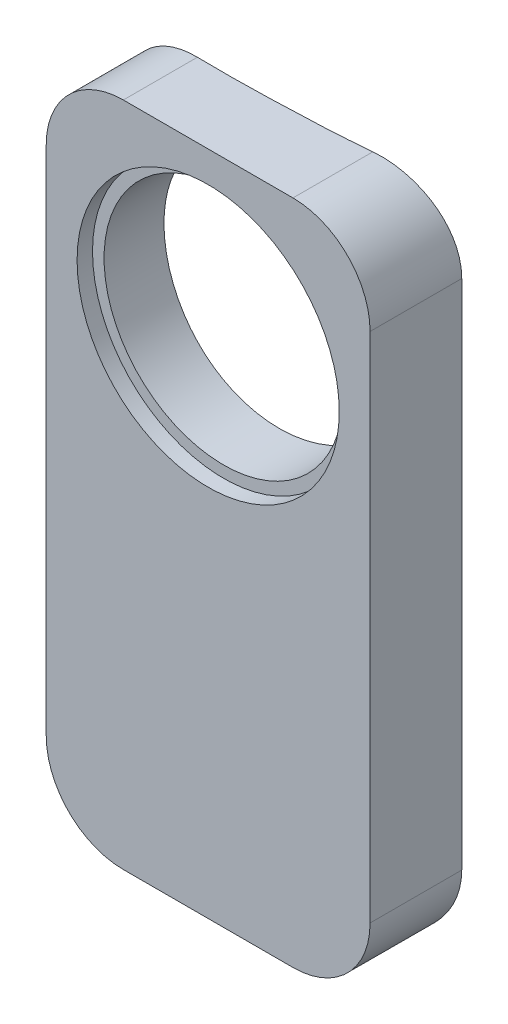
ISO-10303-21;
HEADER;
FILE_DESCRIPTION(('STEP AP214'),'2;1');
FILE_NAME('part.step','',(''),(''),'','','');
FILE_SCHEMA(('AUTOMOTIVE_DESIGN { 1 0 10303 214 1 1 1 1 }'));
ENDSEC;
DATA;
#1=APPLICATION_CONTEXT('core data for automotive mechanical design processes');
#2=APPLICATION_PROTOCOL_DEFINITION('international standard','automotive_design',2000,#1);
#3=PRODUCT_CONTEXT('',#1,'mechanical');
#4=PRODUCT('Part','Part','',(#3));
#5=PRODUCT_RELATED_PRODUCT_CATEGORY('part','',(#4));
#6=PRODUCT_DEFINITION_FORMATION('','',#4);
#7=PRODUCT_DEFINITION_CONTEXT('part definition',#1,'design');
#8=PRODUCT_DEFINITION('design','',#6,#7);
#9=PRODUCT_DEFINITION_SHAPE('','',#8);
#10=(LENGTH_UNIT() NAMED_UNIT(*) SI_UNIT(.MILLI.,.METRE.));
#11=(NAMED_UNIT(*) PLANE_ANGLE_UNIT() SI_UNIT($,.RADIAN.));
#12=(NAMED_UNIT(*) SI_UNIT($,.STERADIAN.) SOLID_ANGLE_UNIT());
#13=UNCERTAINTY_MEASURE_WITH_UNIT(LENGTH_MEASURE(1.E-05),#10,'distance_accuracy_value','');
#14=(GEOMETRIC_REPRESENTATION_CONTEXT(3) GLOBAL_UNCERTAINTY_ASSIGNED_CONTEXT((#13)) GLOBAL_UNIT_ASSIGNED_CONTEXT((#10,
#11,#12)) REPRESENTATION_CONTEXT('',''));
#15=CARTESIAN_POINT('',(0.,0.,0.));
#16=DIRECTION('',(0.,0.,1.));
#17=DIRECTION('',(1.,0.,0.));
#18=AXIS2_PLACEMENT_3D('',#15,#16,#17);
#19=CARTESIAN_POINT('',(0.,0.,0.0555123375965746));
#20=DIRECTION('',(0.,0.,1.));
#21=DIRECTION('',(1.,0.,0.));
#22=AXIS2_PLACEMENT_3D('',#19,#20,#21);
#23=CYLINDRICAL_SURFACE('',#22,7.75);
#24=CARTESIAN_POINT('',(7.75,0.,0.556460774039255));
#25=CARTESIAN_POINT('',(7.75000200068598,0.216620615534205,0.556459825629976));
#26=CARTESIAN_POINT('',(7.74091407571895,0.433210810794264,0.557768306764412));
#27=CARTESIAN_POINT('',(7.70463176937442,0.864908422155094,0.562953362583436));
#28=CARTESIAN_POINT('',(7.67743288023728,1.08001545563126,0.566830576616018));
#29=CARTESIAN_POINT('',(7.60509719712533,1.50731414788245,0.577020177108089));
#30=CARTESIAN_POINT('',(7.55994536755869,1.71950320835426,0.583334604604359));
#31=CARTESIAN_POINT('',(7.45202321166566,2.13935664678895,0.598178057194127));
#32=CARTESIAN_POINT('',(7.38924640750139,2.34701933084114,0.606707896447863));
#33=CARTESIAN_POINT('',(7.24661764651993,2.75606634730002,0.625677931065135));
#34=CARTESIAN_POINT('',(7.16678312397099,2.95745685133761,0.636116174336197));
#35=CARTESIAN_POINT('',(6.99057775983197,3.35278346150416,0.658562881090003));
#36=CARTESIAN_POINT('',(6.89420645883228,3.54671936035286,0.67057138819417));
#37=CARTESIAN_POINT('',(6.68563812895735,3.92575151435534,0.695774999266271));
#38=CARTESIAN_POINT('',(6.57344437525257,4.1108495883086,0.708969857460955));
#39=CARTESIAN_POINT('',(6.33400433566454,4.47097817592973,0.736153025907575));
#40=CARTESIAN_POINT('',(6.20675795399465,4.64600862552224,0.75014134120834));
#41=CARTESIAN_POINT('',(5.93722567025198,4.9858999959258,0.77861292925349));
#42=CARTESIAN_POINT('',(5.79484759790025,5.15068761534995,0.793098823289508));
#43=CARTESIAN_POINT('',(5.4967384133625,5.46769669443391,0.822103871793565));
#44=CARTESIAN_POINT('',(5.34100754903759,5.61991838724574,0.836623025639351));
#45=CARTESIAN_POINT('',(5.01724218467072,5.91076513352143,0.865363877499151));
#46=CARTESIAN_POINT('',(4.84920507831989,6.04938729214464,0.879585511677486));
#47=CARTESIAN_POINT('',(4.50209050365511,6.31197472602175,0.907443317489822));
#48=CARTESIAN_POINT('',(4.32301686083049,6.43594503691598,0.921079689238368));
#49=CARTESIAN_POINT('',(3.9543997699784,6.66880122053158,0.947602445579043));
#50=CARTESIAN_POINT('',(3.76482254265877,6.7776339388501,0.960486099598911));
#51=CARTESIAN_POINT('',(3.37710475940327,6.97892356701096,0.985306839003932));
#52=CARTESIAN_POINT('',(3.17896417785598,7.07138042787191,0.997243921557763));
#53=CARTESIAN_POINT('',(2.77552894109341,7.2392454038793,1.02010015967746));
#54=CARTESIAN_POINT('',(2.57023421806059,7.31465335736021,1.03101930559021));
#55=CARTESIAN_POINT('',(2.15396395414576,7.44786511442326,1.05183865204699));
#56=CARTESIAN_POINT('',(1.94298851261992,7.50566922568044,1.06173887039755));
#57=CARTESIAN_POINT('',(1.51743528846855,7.60311853027198,1.08056369795485));
#58=CARTESIAN_POINT('',(1.30286860204772,7.64281169741011,1.08949083637207));
#59=CARTESIAN_POINT('',(0.871120268017514,7.70397208268001,1.10650840555229));
#60=CARTESIAN_POINT('',(0.6539386196367,7.72543929543487,1.11459883606846));
#61=CARTESIAN_POINT('',(0.218516015553787,7.74998712549245,1.13014416570001));
#62=CARTESIAN_POINT('',(0.000275059578754521,7.75306773805756,1.13759906465164));
#63=CARTESIAN_POINT('',(-0.435714153620112,7.7408146932566,1.15174884517008));
#64=CARTESIAN_POINT('',(-0.653462411513225,7.72548106091939,1.1584437277699));
#65=CARTESIAN_POINT('',(-1.08670678082928,7.67652566636571,1.17085063463215));
#66=CARTESIAN_POINT('',(-1.30220487936012,7.64292173223398,1.17656360989494));
#67=CARTESIAN_POINT('',(-1.72962947963072,7.55766971743151,1.1868621823306));
#68=CARTESIAN_POINT('',(-1.94155598484482,7.5060216543146,1.19144778060019));
#69=CARTESIAN_POINT('',(-2.36028011248609,7.38505641927857,1.19937490567254));
#70=CARTESIAN_POINT('',(-2.56707881408798,7.31574300036413,1.20271669635164));
#71=CARTESIAN_POINT('',(-2.97419080060702,7.15990313594144,1.20809687311319));
#72=CARTESIAN_POINT('',(-3.17450166808609,7.0733703581886,1.21013477853949));
#73=CARTESIAN_POINT('',(-3.56665473866052,6.88395068022158,1.21289663725338));
#74=CARTESIAN_POINT('',(-3.75851601159879,6.78110330245406,1.21362371471971));
#75=CARTESIAN_POINT('',(-4.13291356396795,6.55963652912498,1.21382674615543));
#76=CARTESIAN_POINT('',(-4.31544969848274,6.44101688855975,1.21330268068764));
#77=CARTESIAN_POINT('',(-4.66989373460696,6.18885260361765,1.21111341920493));
#78=CARTESIAN_POINT('',(-4.84180173997949,6.05530810498888,1.20944823433275));
#79=CARTESIAN_POINT('',(-5.17377591974512,5.77423982137148,1.20513888764837));
#80=CARTESIAN_POINT('',(-5.33384180661275,5.62671569715715,1.2024947020755));
#81=CARTESIAN_POINT('',(-5.64095231928934,5.31878081499386,1.19643448462371));
#82=CARTESIAN_POINT('',(-5.78800049358107,5.15837359171329,1.19301866399121));
#83=CARTESIAN_POINT('',(-6.06813546909724,4.82571575284713,1.18565452853473));
#84=CARTESIAN_POINT('',(-6.20121742326605,4.65346105963845,1.1817060299213));
#85=CARTESIAN_POINT('',(-6.45240151078785,4.29840622451585,1.1735376255534));
#86=CARTESIAN_POINT('',(-6.57050620311986,4.11560789184865,1.16931776634914));
#87=CARTESIAN_POINT('',(-6.790931465222,3.74072607731468,1.16089122659371));
#88=CARTESIAN_POINT('',(-6.89325177763773,3.54864244412398,1.15668454625851));
#89=CARTESIAN_POINT('',(-7.08157190584224,3.15615458520135,1.14855132657562));
#90=CARTESIAN_POINT('',(-7.16753861181469,2.95573445974315,1.14462536539358));
#91=CARTESIAN_POINT('',(-7.3222868267644,2.54835118271656,1.13730134394519));
#92=CARTESIAN_POINT('',(-7.39106793452891,2.34138787851902,1.13390329600414));
#93=CARTESIAN_POINT('',(-7.51093958052739,1.92243341499991,1.12783387538699));
#94=CARTESIAN_POINT('',(-7.5620335898532,1.71044325093473,1.12516236015099));
#95=CARTESIAN_POINT('',(-7.64619858590082,1.28282821922419,1.12069491111487));
#96=CARTESIAN_POINT('',(-7.67926325101664,1.06720210399422,1.11889928444968));
#97=CARTESIAN_POINT('',(-7.7270789938529,0.63415579126418,1.11628564373084));
#98=CARTESIAN_POINT('',(-7.74184955964857,0.416737751699474,1.11546658940304));
#99=CARTESIAN_POINT('',(-7.75303805762767,-0.0186702478636253,1.11484712910711));
#100=CARTESIAN_POINT('',(-7.74944767225898,-0.236660422341721,1.11504718479796));
#101=CARTESIAN_POINT('',(-7.72392091845383,-0.6715600662745,1.11645612239231));
#102=CARTESIAN_POINT('',(-7.70198459245432,-0.888469538227844,1.11766500196225));
#103=CARTESIAN_POINT('',(-7.63993775659628,-1.31956548082381,1.12102462721954));
#104=CARTESIAN_POINT('',(-7.5998354800931,-1.53375313991164,1.12317494620346));
#105=CARTESIAN_POINT('',(-7.5017713480485,-1.95787559468949,1.12829663934035));
#106=CARTESIAN_POINT('',(-7.44381855028093,-2.16781248986943,1.13126759700324));
#107=CARTESIAN_POINT('',(-7.31048349474367,-2.58198447104249,1.13786100044125));
#108=CARTESIAN_POINT('',(-7.23510734358771,-2.78622152669829,1.14148321786139));
#109=CARTESIAN_POINT('',(-7.06743315694285,-3.18766625535564,1.14916680685826));
#110=CARTESIAN_POINT('',(-6.97513174952102,-3.38487251828047,1.15322826587659));
#111=CARTESIAN_POINT('',(-6.77427293433581,-3.77081548774312,1.16153826862524));
#112=CARTESIAN_POINT('',(-6.66571586367646,-3.95955236981041,1.16578680847464));
#113=CARTESIAN_POINT('',(-6.43294733151858,-4.32748706485926,1.1741896831102));
#114=CARTESIAN_POINT('',(-6.30871408662868,-4.50667110073446,1.17834387712891));
#115=CARTESIAN_POINT('',(-6.04559445680954,-4.85394108082402,1.18627637496243));
#116=CARTESIAN_POINT('',(-5.90670830703935,-5.02202720307433,1.19005468480776));
#117=CARTESIAN_POINT('',(-5.61523903564673,-5.34593930119972,1.19698082081355));
#118=CARTESIAN_POINT('',(-5.46265353671953,-5.50176314031195,1.2001285372371));
#119=CARTESIAN_POINT('',(-5.14494399683353,-5.79995684259186,1.20556146578878));
#120=CARTESIAN_POINT('',(-4.97982434075388,-5.94233137202567,1.2078469778905));
#121=CARTESIAN_POINT('',(-4.63818613593192,-6.21266243589758,1.21136594892362));
#122=CARTESIAN_POINT('',(-4.46166845013447,-6.34062005983097,1.21259948739972));
#123=CARTESIAN_POINT('',(-4.09848462163646,-6.58121337772272,1.2138717545937));
#124=CARTESIAN_POINT('',(-3.91181871635551,-6.69384942991658,1.2139105112517));
#125=CARTESIAN_POINT('',(-3.52966606935916,-6.90299962359499,1.21270497975289));
#126=CARTESIAN_POINT('',(-3.33417927955941,-6.99951367718191,1.21146068460111));
#127=CARTESIAN_POINT('',(-2.93578590182097,-7.1757301169929,1.20765882898782));
#128=CARTESIAN_POINT('',(-2.73287943268066,-7.25543277225036,1.20510128954444));
#129=CARTESIAN_POINT('',(-2.32146072017027,-7.39733644619041,1.19870703291399));
#130=CARTESIAN_POINT('',(-2.11295910088823,-7.45956837320379,1.19487260136127));
#131=CARTESIAN_POINT('',(-1.69156487863524,-7.56626262862623,1.18600712030548));
#132=CARTESIAN_POINT('',(-1.47867392184261,-7.61073149585466,1.18097651222084));
#133=CARTESIAN_POINT('',(-1.0498924641298,-7.68163104345506,1.16985139775054));
#134=CARTESIAN_POINT('',(-0.834001362001133,-7.70805805358509,1.16375667520933));
#135=CARTESIAN_POINT('',(-0.400789205209796,-7.74267954224293,1.15066454228985));
#136=CARTESIAN_POINT('',(-0.183468146323258,-7.75087396689024,1.14366712924405));
#137=CARTESIAN_POINT('',(0.251334695168083,-7.7489774581731,1.12900558679566));
#138=CARTESIAN_POINT('',(0.468816354500994,-7.73886440920572,1.12134066168071));
#139=CARTESIAN_POINT('',(0.902132736824046,-7.70038746998214,1.10530595334186));
#140=CARTESIAN_POINT('',(1.1179674615421,-7.67202359887679,1.0969361708576));
#141=CARTESIAN_POINT('',(1.54644940931215,-7.59725545215617,1.07931536965098));
#142=CARTESIAN_POINT('',(1.75909668068345,-7.55085145030306,1.07006436430295));
#143=CARTESIAN_POINT('',(2.17969560861501,-7.44034314191562,1.05058979433551));
#144=CARTESIAN_POINT('',(2.38764726093941,-7.3762388194148,1.0403662288388));
#145=CARTESIAN_POINT('',(2.79767906276823,-7.23069073533368,1.01888733093902));
#146=CARTESIAN_POINT('',(2.99975020270124,-7.14922181094726,1.00763051489103));
#147=CARTESIAN_POINT('',(3.39634463560439,-6.96955897302997,0.984119652445192));
#148=CARTESIAN_POINT('',(3.59086511975808,-6.87135890741396,0.971865240097168));
#149=CARTESIAN_POINT('',(3.97086682378129,-6.6589851390612,0.946462945435203));
#150=CARTESIAN_POINT('',(4.15634990419563,-6.54481474305692,0.933315248369178));
#151=CARTESIAN_POINT('',(4.51702150120416,-6.30129861717936,0.906294174792074));
#152=CARTESIAN_POINT('',(4.69220976685783,-6.17195251762189,0.892420780607382));
#153=CARTESIAN_POINT('',(5.03131057926818,-5.89880355565739,0.864167227822025));
#154=CARTESIAN_POINT('',(5.19520620517407,-5.75497976073709,0.849786355561826));
#155=CARTESIAN_POINT('',(5.51029262783773,-5.45404761617588,0.820839110072965));
#156=CARTESIAN_POINT('',(5.66148340866215,-5.29693924987508,0.806272736611689));
#157=CARTESIAN_POINT('',(5.95014159454277,-4.97049298941619,0.777302376103496));
#158=CARTESIAN_POINT('',(6.08760523380949,-4.80115176123442,0.762898434572888));
#159=CARTESIAN_POINT('',(6.34779253675499,-4.45146312796598,0.734644315868411));
#160=CARTESIAN_POINT('',(6.47051653609898,-4.27111597365794,0.720794126088769));
#161=CARTESIAN_POINT('',(6.70067045744109,-3.90016504740926,0.694014901613364));
#162=CARTESIAN_POINT('',(6.80805796269902,-3.70953476470319,0.681088469240722));
#163=CARTESIAN_POINT('',(7.00632964582229,-3.31988164115129,0.656607630450005));
#164=CARTESIAN_POINT('',(7.09721991972148,-3.12086193398955,0.645052717778315));
#165=CARTESIAN_POINT('',(7.26180780825639,-2.71594564850769,0.623699906441443));
#166=CARTESIAN_POINT('',(7.33552061451005,-2.51005533217494,0.61390045704606));
#167=CARTESIAN_POINT('',(7.46528974061881,-2.09277128064999,0.596384030991208));
#168=CARTESIAN_POINT('',(7.52135065335262,-1.88137899254987,0.58866651270523));
#169=CARTESIAN_POINT('',(7.62866123436405,-1.39442698928263,0.57374442475737));
#170=CARTESIAN_POINT('',(7.67411920443127,-1.11754771664172,0.567295127861201));
#171=CARTESIAN_POINT('',(7.73478715943097,-0.560428644863643,0.558653934713457));
#172=CARTESIAN_POINT('',(7.74999741220403,-0.280188875505445,0.556462000763354));
#173=CARTESIAN_POINT('',(7.75,0.,0.556460774039255));
#174=B_SPLINE_CURVE_WITH_KNOTS('',3,(#24,#25,#26,#27,#28,#29,#30,#31,#32,#33,#34,#35,#36,#37,
#38,#39,#40,#41,#42,#43,#44,#45,#46,#47,#48,#49,#50,#51,#52,#53,#54,#55,#56,#57,#58,#59,#60,#61,
#62,#63,#64,#65,#66,#67,#68,#69,#70,#71,#72,#73,#74,#75,#76,#77,#78,#79,#80,#81,#82,#83,#84,#85,
#86,#87,#88,#89,#90,#91,#92,#93,#94,#95,#96,#97,#98,#99,#100,#101,#102,#103,#104,#105,#106,#107,
#108,#109,#110,#111,#112,#113,#114,#115,#116,#117,#118,#119,#120,#121,#122,#123,#124,#125,#126,
#127,#128,#129,#130,#131,#132,#133,#134,#135,#136,#137,#138,#139,#140,#141,#142,#143,#144,#145,
#146,#147,#148,#149,#150,#151,#152,#153,#154,#155,#156,#157,#158,#159,#160,#161,#162,#163,#164,
#165,#166,#167,#168,#169,#170,#171,#172,#173),.UNSPECIFIED.,.T.,.F.,(4,2,2,2,2,2,2,2,2,2,2,2,2,
2,2,2,2,2,2,2,2,2,2,2,2,2,2,2,2,2,2,2,2,2,2,2,2,2,2,2,2,2,2,2,2,2,2,2,2,2,2,2,2,2,2,2,2,2,2,2,2,
2,2,2,2,2,2,2,2,2,2,2,2,2,4),(0.,0.64961519870062,1.29939214496324,1.94971442969158,
2.60027604580602,3.25017589294371,3.900093797927,4.549877369998,5.19966507715655,
5.85366618997202,6.50765516552341,7.16178305059094,7.81568546301242,8.47182896664582,
9.12797443281917,9.78412612060235,10.4402663396916,11.09465828233,11.7490504180232,
12.403442722331,13.0578341371816,13.7115881426572,14.3653415121452,15.0189561073445,
15.6728115083547,16.325106464102,16.977411553673,17.6297102737417,18.2820248263646,
18.9341610142735,19.5865227864232,20.2387729470006,20.8910337409825,21.5446013779192,
22.1981842715364,22.851638826743,23.505322354797,24.1583089356613,24.8115913471092,
25.46487224742,26.1178573569566,26.7705116708353,27.4229375854596,28.0754936210861,
28.7280361261166,29.3814955922398,30.0349445728284,30.6885071691133,31.3418421711859,
31.9951277671285,32.6483980858959,33.3016719661968,33.9549353913397,34.6070357060462,
35.2588957522175,35.9108883663239,36.5628829071803,37.2156655893133,37.8684475864736,
38.5212196779388,39.1739923582356,39.8277174727731,40.4816834846032,41.1355142895581,
41.7893610253141,42.4441670845845,43.0989739650458,43.7539599891051,44.4089310943651,
45.0656799822068,45.7221856928531,46.3781085726183,47.0338606453005,47.8741156844262,
48.7143632831431),.UNSPECIFIED.);
#175=CARTESIAN_POINT('',(7.75,0.,0.556460774039255));
#176=VERTEX_POINT('',#175);
#177=EDGE_CURVE('E136',#176,#176,#174,.T.);
#178=ORIENTED_EDGE('',*,*,#177,.F.);
#179=EDGE_LOOP('',(#178));
#180=FACE_BOUND('',#179,.T.);
#181=CARTESIAN_POINT('',(0.,0.,5.));
#182=DIRECTION('',(0.,0.,1.));
#183=DIRECTION('',(1.,0.,0.));
#184=AXIS2_PLACEMENT_3D('',#181,#182,#183);
#185=CIRCLE('',#184,7.75);
#186=CARTESIAN_POINT('',(7.75,0.,5.));
#187=VERTEX_POINT('',#186);
#188=EDGE_CURVE('E40',#187,#187,#185,.F.);
#189=ORIENTED_EDGE('',*,*,#188,.F.);
#190=EDGE_LOOP('',(#189));
#191=FACE_BOUND('',#190,.T.);
#192=ADVANCED_FACE('F35',(#180,#191),#23,.F.);
#193=CARTESIAN_POINT('',(-10.4999997623012,-32.7185040065443,6.));
#194=DIRECTION('',(1.,0.,0.));
#195=DIRECTION('',(0.,1.,0.));
#196=AXIS2_PLACEMENT_3D('',#193,#194,#195);
#197=PLANE('',#196);
#198=DIRECTION('',(0.,1.,0.));
#199=VECTOR('',#198,1.);
#200=CARTESIAN_POINT('',(-10.4999997623012,-32.7185040065443,0.903157095993817));
#201=LINE('',#200,#199);
#202=CARTESIAN_POINT('',(-10.4999997623012,5.5,0.903157095993817));
#203=VERTEX_POINT('',#202);
#204=CARTESIAN_POINT('',(-10.4999997623012,-27.7185040065443,0.903157095993817));
#205=VERTEX_POINT('',#204);
#206=EDGE_CURVE('E133',#203,#205,#201,.F.);
#207=ORIENTED_EDGE('',*,*,#206,.T.);
#208=DIRECTION('',(0.,0.,-1.));
#209=VECTOR('',#208,1.);
#210=CARTESIAN_POINT('',(-10.4999997623012,-27.7185040065443,6.));
#211=LINE('',#210,#209);
#212=CARTESIAN_POINT('',(-10.4999997623012,-27.7185040065443,6.));
#213=VERTEX_POINT('',#212);
#214=EDGE_CURVE('E108',#205,#213,#211,.F.);
#215=ORIENTED_EDGE('',*,*,#214,.T.);
#216=DIRECTION('',(0.,-1.,0.));
#217=VECTOR('',#216,1.);
#218=CARTESIAN_POINT('',(-10.4999997623012,10.5,6.));
#219=LINE('',#218,#217);
#220=CARTESIAN_POINT('',(-10.4999997623012,5.5,6.));
#221=VERTEX_POINT('',#220);
#222=EDGE_CURVE('E233',#221,#213,#219,.T.);
#223=ORIENTED_EDGE('',*,*,#222,.F.);
#224=DIRECTION('',(0.,0.,-1.));
#225=VECTOR('',#224,1.);
#226=CARTESIAN_POINT('',(-10.4999997623012,5.5,6.));
#227=LINE('',#226,#225);
#228=EDGE_CURVE('E113',#221,#203,#227,.T.);
#229=ORIENTED_EDGE('',*,*,#228,.T.);
#230=EDGE_LOOP('',(#207,#215,#223,#229));
#231=FACE_BOUND('',#230,.T.);
#232=ADVANCED_FACE('F208',(#231),#197,.F.);
#233=CARTESIAN_POINT('',(10.5000002376988,-32.7185040065443,6.));
#234=DIRECTION('',(0.,1.,0.));
#235=DIRECTION('',(0.,0.,1.));
#236=AXIS2_PLACEMENT_3D('',#233,#234,#235);
#237=PLANE('',#236);
#238=DIRECTION('',(1.,0.,0.));
#239=VECTOR('',#238,1.);
#240=CARTESIAN_POINT('',(10.5000002376988,-32.7185040065443,6.));
#241=LINE('',#240,#239);
#242=CARTESIAN_POINT('',(-5.49999976230116,-32.7185040065443,6.));
#243=VERTEX_POINT('',#242);
#244=CARTESIAN_POINT('',(5.50000023769884,-32.7185040065443,6.));
#245=VERTEX_POINT('',#244);
#246=EDGE_CURVE('E123',#243,#245,#241,.T.);
#247=ORIENTED_EDGE('',*,*,#246,.F.);
#248=DIRECTION('',(0.,0.,-1.));
#249=VECTOR('',#248,1.);
#250=CARTESIAN_POINT('',(-5.49999976230116,-32.7185040065443,6.));
#251=LINE('',#250,#249);
#252=CARTESIAN_POINT('',(-5.49999976230052,-32.7185040065443,1.19921475462377));
#253=VERTEX_POINT('',#252);
#254=EDGE_CURVE('E107',#243,#253,#251,.T.);
#255=ORIENTED_EDGE('',*,*,#254,.T.);
#256=CARTESIAN_POINT('',(-19.020487649144,-32.7185040065443,-0.476624039849147));
#257=CARTESIAN_POINT('',(-14.9079385765558,-32.7185040065443,0.444262453309699));
#258=CARTESIAN_POINT('',(-8.45569815312383,-32.7185040065443,1.33389386383832));
#259=CARTESIAN_POINT('',(2.53687662577055,-32.7185040065443,1.1180987257893));
#260=CARTESIAN_POINT('',(9.34047957278488,-32.7185040065443,0.673611335298155));
#261=CARTESIAN_POINT('',(13.6565450290173,-32.7185040065443,-0.844180337531554));
#262=B_SPLINE_CURVE_WITH_KNOTS('',3,(#256,#257,#258,#259,#260,#261),.UNSPECIFIED.,.F.,.F.,(4,1,
1,4),(0.,0.383694850220746,0.588358138102314,1.),.UNSPECIFIED.);
#263=CARTESIAN_POINT('',(5.50000023769882,-32.7185040065443,0.821586858747061));
#264=VERTEX_POINT('',#263);
#265=EDGE_CURVE('E120',#253,#264,#262,.T.);
#266=ORIENTED_EDGE('',*,*,#265,.T.);
#267=DIRECTION('',(0.,0.,-1.));
#268=VECTOR('',#267,1.);
#269=CARTESIAN_POINT('',(5.50000023769884,-32.7185040065443,6.));
#270=LINE('',#269,#268);
#271=EDGE_CURVE('E125',#264,#245,#270,.F.);
#272=ORIENTED_EDGE('',*,*,#271,.T.);
#273=EDGE_LOOP('',(#247,#255,#266,#272));
#274=FACE_BOUND('',#273,.T.);
#275=ADVANCED_FACE('F119',(#274),#237,.F.);
#276=CARTESIAN_POINT('',(10.5000002376988,-10.5000004753977,6.));
#277=DIRECTION('',(-1.,0.,0.));
#278=DIRECTION('',(0.,-1.,0.));
#279=AXIS2_PLACEMENT_3D('',#276,#277,#278);
#280=PLANE('',#279);
#281=DIRECTION('',(0.,1.,0.));
#282=VECTOR('',#281,1.);
#283=CARTESIAN_POINT('',(10.5000002376988,-10.5000004753977,6.));
#284=LINE('',#283,#282);
#285=CARTESIAN_POINT('',(10.5000002376988,-27.7185040065443,6.));
#286=VERTEX_POINT('',#285);
#287=CARTESIAN_POINT('',(10.5000002376988,5.5,6.));
#288=VERTEX_POINT('',#287);
#289=EDGE_CURVE('E255',#286,#288,#284,.T.);
#290=ORIENTED_EDGE('',*,*,#289,.F.);
#291=DIRECTION('',(0.,0.,-1.));
#292=VECTOR('',#291,1.);
#293=CARTESIAN_POINT('',(10.5000002376988,-27.7185040065443,6.));
#294=LINE('',#293,#292);
#295=CARTESIAN_POINT('',(10.5000002376988,-27.7185040065443,0.0555123375968231));
#296=VERTEX_POINT('',#295);
#297=EDGE_CURVE('E243',#286,#296,#294,.T.);
#298=ORIENTED_EDGE('',*,*,#297,.T.);
#299=DIRECTION('',(0.,1.,0.));
#300=VECTOR('',#299,1.);
#301=CARTESIAN_POINT('',(10.5000002376988,-32.7185040065443,0.0555123375968231));
#302=LINE('',#301,#300);
#303=CARTESIAN_POINT('',(10.5000002376988,5.5,0.0555123375968231));
#304=VERTEX_POINT('',#303);
#305=EDGE_CURVE('E129',#296,#304,#302,.T.);
#306=ORIENTED_EDGE('',*,*,#305,.T.);
#307=DIRECTION('',(0.,0.,-1.));
#308=VECTOR('',#307,1.);
#309=CARTESIAN_POINT('',(10.5000002376988,5.5,6.));
#310=LINE('',#309,#308);
#311=EDGE_CURVE('E240',#304,#288,#310,.F.);
#312=ORIENTED_EDGE('',*,*,#311,.T.);
#313=EDGE_LOOP('',(#290,#298,#306,#312));
#314=FACE_BOUND('',#313,.T.);
#315=ADVANCED_FACE('F253',(#314),#280,.F.);
#316=CARTESIAN_POINT('',(-10.4999997623012,10.5,6.));
#317=DIRECTION('',(0.,-1.,0.));
#318=DIRECTION('',(0.,0.,-1.));
#319=AXIS2_PLACEMENT_3D('',#316,#317,#318);
#320=PLANE('',#319);
#321=DIRECTION('',(-1.,0.,0.));
#322=VECTOR('',#321,1.);
#323=CARTESIAN_POINT('',(-10.4999997623012,10.5,6.));
#324=LINE('',#323,#322);
#325=CARTESIAN_POINT('',(5.50000023769884,10.5,6.));
#326=VERTEX_POINT('',#325);
#327=CARTESIAN_POINT('',(-5.49999976230117,10.5,6.));
#328=VERTEX_POINT('',#327);
#329=EDGE_CURVE('E263',#326,#328,#324,.T.);
#330=ORIENTED_EDGE('',*,*,#329,.F.);
#331=DIRECTION('',(0.,0.,-1.));
#332=VECTOR('',#331,1.);
#333=CARTESIAN_POINT('',(5.50000023769884,10.5,6.));
#334=LINE('',#333,#332);
#335=CARTESIAN_POINT('',(5.50000023769882,10.5,0.821586858747061));
#336=VERTEX_POINT('',#335);
#337=EDGE_CURVE('E11',#326,#336,#334,.T.);
#338=ORIENTED_EDGE('',*,*,#337,.T.);
#339=CARTESIAN_POINT('',(-19.020487649144,10.5,-0.476624039849147));
#340=CARTESIAN_POINT('',(-14.9079385765558,10.5,0.444262453309699));
#341=CARTESIAN_POINT('',(-8.45569815312383,10.5,1.33389386383832));
#342=CARTESIAN_POINT('',(2.53687662577055,10.5,1.1180987257893));
#343=CARTESIAN_POINT('',(9.34047957278488,10.5,0.673611335298155));
#344=CARTESIAN_POINT('',(13.6565450290173,10.5,-0.844180337531554));
#345=B_SPLINE_CURVE_WITH_KNOTS('',3,(#339,#340,#341,#342,#343,#344),.UNSPECIFIED.,.F.,.F.,(4,1,
1,4),(0.,0.383694850220746,0.588358138102314,1.),.UNSPECIFIED.);
#346=CARTESIAN_POINT('',(-5.49999976230053,10.5,1.19921475462377));
#347=VERTEX_POINT('',#346);
#348=EDGE_CURVE('E130',#347,#336,#345,.T.);
#349=ORIENTED_EDGE('',*,*,#348,.F.);
#350=DIRECTION('',(0.,0.,-1.));
#351=VECTOR('',#350,1.);
#352=CARTESIAN_POINT('',(-5.49999976230117,10.5,6.));
#353=LINE('',#352,#351);
#354=EDGE_CURVE('E45',#347,#328,#353,.F.);
#355=ORIENTED_EDGE('',*,*,#354,.T.);
#356=EDGE_LOOP('',(#330,#338,#349,#355));
#357=FACE_BOUND('',#356,.T.);
#358=ADVANCED_FACE('F230',(#357),#320,.F.);
#359=CARTESIAN_POINT('',(0.,0.,6.));
#360=DIRECTION('',(0.,0.,-1.));
#361=DIRECTION('',(-1.,0.,0.));
#362=AXIS2_PLACEMENT_3D('',#359,#360,#361);
#363=PLANE('',#362);
#364=CARTESIAN_POINT('',(0.,0.,6.));
#365=DIRECTION('',(0.,0.,1.));
#366=DIRECTION('',(1.,0.,0.));
#367=AXIS2_PLACEMENT_3D('',#364,#365,#366);
#368=CIRCLE('',#367,8.5);
#369=CARTESIAN_POINT('',(8.5,0.,6.));
#370=VERTEX_POINT('',#369);
#371=EDGE_CURVE('E142',#370,#370,#368,.T.);
#372=ORIENTED_EDGE('',*,*,#371,.F.);
#373=EDGE_LOOP('',(#372));
#374=FACE_BOUND('',#373,.T.);
#375=ORIENTED_EDGE('',*,*,#222,.T.);
#376=CARTESIAN_POINT('',(-5.49999976230116,-27.7185040065443,6.));
#377=DIRECTION('',(0.,0.,-1.));
#378=DIRECTION('',(-1.,0.,0.));
#379=AXIS2_PLACEMENT_3D('',#376,#377,#378);
#380=CIRCLE('',#379,5.);
#381=EDGE_CURVE('E234',#213,#243,#380,.F.);
#382=ORIENTED_EDGE('',*,*,#381,.T.);
#383=ORIENTED_EDGE('',*,*,#246,.T.);
#384=CARTESIAN_POINT('',(5.50000023769884,-27.7185040065443,6.));
#385=DIRECTION('',(0.,0.,-1.));
#386=DIRECTION('',(-1.,0.,0.));
#387=AXIS2_PLACEMENT_3D('',#384,#385,#386);
#388=CIRCLE('',#387,5.);
#389=EDGE_CURVE('E241',#245,#286,#388,.F.);
#390=ORIENTED_EDGE('',*,*,#389,.T.);
#391=ORIENTED_EDGE('',*,*,#289,.T.);
#392=CARTESIAN_POINT('',(5.50000023769884,5.5,6.));
#393=DIRECTION('',(0.,0.,-1.));
#394=DIRECTION('',(-1.,0.,0.));
#395=AXIS2_PLACEMENT_3D('',#392,#393,#394);
#396=CIRCLE('',#395,5.);
#397=EDGE_CURVE('E58',#288,#326,#396,.F.);
#398=ORIENTED_EDGE('',*,*,#397,.T.);
#399=ORIENTED_EDGE('',*,*,#329,.T.);
#400=CARTESIAN_POINT('',(-5.49999976230117,5.5,6.));
#401=DIRECTION('',(0.,0.,-1.));
#402=DIRECTION('',(-1.,0.,0.));
#403=AXIS2_PLACEMENT_3D('',#400,#401,#402);
#404=CIRCLE('',#403,5.);
#405=EDGE_CURVE('E236',#328,#221,#404,.F.);
#406=ORIENTED_EDGE('',*,*,#405,.T.);
#407=EDGE_LOOP('',(#375,#382,#383,#390,#391,#398,#399,#406));
#408=FACE_BOUND('',#407,.T.);
#409=ADVANCED_FACE('F154',(#374,#408),#363,.F.);
#410=DIRECTION('',(0.,1.,0.));
#411=VECTOR('',#410,1.);
#412=SURFACE_OF_LINEAR_EXTRUSION('',#262,#411);
#413=ORIENTED_EDGE('',*,*,#177,.T.);
#414=EDGE_LOOP('',(#413));
#415=FACE_BOUND('',#414,.T.);
#416=ORIENTED_EDGE('',*,*,#265,.F.);
#417=CARTESIAN_POINT('',(-5.49999976230116,-32.7185040065443,1.19921475465555));
#418=CARTESIAN_POINT('',(-5.64056062377684,-32.71851940155,1.19641908554389));
#419=CARTESIAN_POINT('',(-5.78111021473049,-32.7125774608365,1.19318568411093));
#420=CARTESIAN_POINT('',(-6.06118027860812,-32.6888947089145,1.18585077290861));
#421=CARTESIAN_POINT('',(-6.20070081712514,-32.6711546564194,1.18174931897358));
#422=CARTESIAN_POINT('',(-6.47759930844337,-32.6240127735524,1.17268939494338));
#423=CARTESIAN_POINT('',(-6.61497908424905,-32.5946215007008,1.16773170299994));
#424=CARTESIAN_POINT('',(-6.88674993661984,-32.5243981591254,1.15703363819586));
#425=CARTESIAN_POINT('',(-7.02114103830171,-32.4835661865884,1.15129327191572));
#426=CARTESIAN_POINT('',(-7.28601576151972,-32.3907460368294,1.13914512290027));
#427=CARTESIAN_POINT('',(-7.41649851372376,-32.338755398284,1.13273719307783));
#428=CARTESIAN_POINT('',(-7.6726540631469,-32.2239760007991,1.11938424269993));
#429=CARTESIAN_POINT('',(-7.798325069875,-32.1611832691453,1.11243902506367));
#430=CARTESIAN_POINT('',(-8.04386490408869,-32.0252928224296,1.0981656840022));
#431=CARTESIAN_POINT('',(-8.16373646067576,-31.9522000189938,1.09083774412164));
#432=CARTESIAN_POINT('',(-8.3969419800321,-31.7961767137701,1.07595342108065));
#433=CARTESIAN_POINT('',(-8.51027365014684,-31.7132427927992,1.06839695920635));
#434=CARTESIAN_POINT('',(-8.729800823408,-31.5379487813605,1.05320950668173));
#435=CARTESIAN_POINT('',(-8.83598010638536,-31.4455683878634,1.04557838879246));
#436=CARTESIAN_POINT('',(-9.04018043688928,-31.2521840529882,1.03043094710394));
#437=CARTESIAN_POINT('',(-9.13820148155205,-31.1511801085831,1.02291462334498));
#438=CARTESIAN_POINT('',(-9.3254264369744,-30.9412205450597,1.0081663253759));
#439=CARTESIAN_POINT('',(-9.41462712041427,-30.8322620405754,1.00093445582452));
#440=CARTESIAN_POINT('',(-9.58350698506518,-30.6072323930297,0.986927893655168));
#441=CARTESIAN_POINT('',(-9.66318948124855,-30.4911637477033,0.980153042227897));
#442=CARTESIAN_POINT('',(-9.81258265567194,-30.2525644056604,0.967208694981131));
#443=CARTESIAN_POINT('',(-9.88228217196445,-30.1300266820996,0.961039879151231));
#444=CARTESIAN_POINT('',(-10.0110776046015,-29.879523668718,0.94946368352006));
#445=CARTESIAN_POINT('',(-10.0701774057918,-29.7515603887367,0.94405602490808));
#446=CARTESIAN_POINT('',(-10.1773594827943,-29.4911082380655,0.93412927273096));
#447=CARTESIAN_POINT('',(-10.2254452377169,-29.3586208116975,0.929609898639209));
#448=CARTESIAN_POINT('',(-10.3102594520155,-29.0900855592204,0.921566225351364));
#449=CARTESIAN_POINT('',(-10.3469906945784,-28.9540386144927,0.918041682323457));
#450=CARTESIAN_POINT('',(-10.4184617536979,-28.6365306346564,0.911142977845568));
#451=CARTESIAN_POINT('',(-10.4490349833936,-28.4540958478347,0.908155970340264));
#452=CARTESIAN_POINT('',(-10.4796089934099,-28.1789550357461,0.905161183659367));
#453=CARTESIAN_POINT('',(-10.4872526839947,-28.0870365564348,0.904410546467782));
#454=CARTESIAN_POINT('',(-10.4974474776876,-27.9029209921708,0.903408331103755));
#455=CARTESIAN_POINT('',(-10.4999989185705,-27.8107239261034,0.903156719830359));
#456=CARTESIAN_POINT('',(-10.4999997623012,-27.7185040065443,0.903157095993817));
#457=B_SPLINE_CURVE_WITH_KNOTS('',3,(#417,#418,#419,#420,#421,#422,#423,#424,#425,#426,#427,
#428,#429,#430,#431,#432,#433,#434,#435,#436,#437,#438,#439,#440,#441,#442,#443,#444,#445,#446,
#447,#448,#449,#450,#451,#452,#453,#454,#455,#456),.UNSPECIFIED.,.F.,.F.,(4,2,2,2,2,2,2,2,2,2,2,
2,2,2,2,2,2,2,2,4),(0.,0.421636156929134,0.843245201882463,1.26447308429134,1.68569742536868,
2.10701477369073,2.52848740356597,2.94975972856143,3.37117885070075,3.79352355353001,
4.21586840461474,4.63836722184159,5.06071846045408,5.48353830305606,5.90620286209232,
6.32873372540484,6.75116093684047,7.30487064715742,7.58146753676808,7.85804607877991),.UNSPECIFIED.);
#458=EDGE_CURVE('E103',#253,#205,#457,.T.);
#459=ORIENTED_EDGE('',*,*,#458,.T.);
#460=ORIENTED_EDGE('',*,*,#206,.F.);
#461=CARTESIAN_POINT('',(-10.4999997623012,5.5,0.903157095993817));
#462=CARTESIAN_POINT('',(-10.5000152531932,5.64024488746336,0.903152174608336));
#463=CARTESIAN_POINT('',(-10.494099830607,5.78048715931481,0.903737591170739));
#464=CARTESIAN_POINT('',(-10.470519344882,6.05996225533278,0.906053514243676));
#465=CARTESIAN_POINT('',(-10.4528550338796,6.19919514354092,0.90778394745289));
#466=CARTESIAN_POINT('',(-10.4059111086891,6.47553491494873,0.9123521681898));
#467=CARTESIAN_POINT('',(-10.3766424798293,6.61264368177994,0.915188908380962));
#468=CARTESIAN_POINT('',(-10.3067083428356,6.88389545037153,0.921900891688201));
#469=CARTESIAN_POINT('',(-10.2660429356733,7.01803847839599,0.925776125603561));
#470=CARTESIAN_POINT('',(-10.1735985992072,7.28244008071111,0.934474853708293));
#471=CARTESIAN_POINT('',(-10.1218172202251,7.41269779155822,0.939298556896513));
#472=CARTESIAN_POINT('',(-10.0074987369531,7.66842723427418,0.949781987295518));
#473=CARTESIAN_POINT('',(-9.94495766223144,7.79389717845415,0.95544202301189));
#474=CARTESIAN_POINT('',(-9.80961367018466,8.03905972868558,0.967461419172783));
#475=CARTESIAN_POINT('',(-9.73681572390225,8.15875509591105,0.973820440524226));
#476=CARTESIAN_POINT('',(-9.58142385819787,8.39163969622491,0.987094796100581));
#477=CARTESIAN_POINT('',(-9.49882632729455,8.50482650773058,0.994010335117296));
#478=CARTESIAN_POINT('',(-9.32422260463406,8.72412991307273,1.00825398181157));
#479=CARTESIAN_POINT('',(-9.23219346144949,8.83022816977147,1.01558307541992));
#480=CARTESIAN_POINT('',(-9.03951218457112,9.03433955780744,1.03047248567362));
#481=CARTESIAN_POINT('',(-8.93885685019451,9.13234966138855,1.03803288746923));
#482=CARTESIAN_POINT('',(-8.72967785106294,9.31953859584182,1.05320906928213));
#483=CARTESIAN_POINT('',(-8.6211554598756,9.40871885063869,1.06082484015712));
#484=CARTESIAN_POINT('',(-8.39694983963543,9.57766975026473,1.07594451573733));
#485=CARTESIAN_POINT('',(-8.28126407521318,9.65743703415117,1.08344837965525));
#486=CARTESIAN_POINT('',(-8.04323315112407,9.80717898701216,1.09819650924615));
#487=CARTESIAN_POINT('',(-7.92086967194311,9.87712462049084,1.10543995997957));
#488=CARTESIAN_POINT('',(-7.6706571419681,10.0064488244435,1.11948598914095));
#489=CARTESIAN_POINT('',(-7.5428080736225,10.0658273611042,1.12628856615813));
#490=CARTESIAN_POINT('',(-7.28258750343866,10.1735635848225,1.13930419611267));
#491=CARTESIAN_POINT('',(-7.15021828065512,10.2219267341637,1.14551754034131));
#492=CARTESIAN_POINT('',(-6.88189166927392,10.307307566857,1.15723101390956));
#493=CARTESIAN_POINT('',(-6.74593506910359,10.344327720963,1.16273129841844));
#494=CARTESIAN_POINT('',(-6.42686267327248,10.4168710772516,1.17455356475116));
#495=CARTESIAN_POINT('',(-6.24271547915141,10.4480379954857,1.18056598751213));
#496=CARTESIAN_POINT('',(-5.96494267958295,10.4792085577157,1.18842361153866));
#497=CARTESIAN_POINT('',(-5.87213566012386,10.487002101181,1.19084847815492));
#498=CARTESIAN_POINT('',(-5.68622810001564,10.4973971987981,1.19531667123622));
#499=CARTESIAN_POINT('',(-5.59312757860274,10.4999990864076,1.19736002219819));
#500=CARTESIAN_POINT('',(-5.49999976229999,10.5,1.19921475462378));
#501=B_SPLINE_CURVE_WITH_KNOTS('',3,(#461,#462,#463,#464,#465,#466,#467,#468,#469,#470,#471,
#472,#473,#474,#475,#476,#477,#478,#479,#480,#481,#482,#483,#484,#485,#486,#487,#488,#489,#490,
#491,#492,#493,#494,#495,#496,#497,#498,#499,#500),.UNSPECIFIED.,.F.,.F.,(4,2,2,2,2,2,2,2,2,2,2,
2,2,2,2,2,2,2,2,4),(0.,0.420604970968757,0.841183018384092,1.2613638689537,1.68154099697999,
2.10181081662065,2.52223605383504,2.94245822636951,3.3628357490004,3.78426169255764,
4.20584468568055,4.62735958210716,5.04902452979336,5.4719109106857,5.89479864473399,
6.31747621945958,6.74006166015696,7.29931658249655,7.57868991645775,7.85804530582475),.UNSPECIFIED.);
#502=EDGE_CURVE('E124',#203,#347,#501,.T.);
#503=ORIENTED_EDGE('',*,*,#502,.T.);
#504=ORIENTED_EDGE('',*,*,#348,.T.);
#505=CARTESIAN_POINT('',(5.50000023769884,10.5,0.821586858747046));
#506=CARTESIAN_POINT('',(5.64155445558079,10.5000154560602,0.8082068695396));
#507=CARTESIAN_POINT('',(5.78305090214384,10.4939894345113,0.794263288993948));
#508=CARTESIAN_POINT('',(6.06490610748202,10.4699941927347,0.765320507995382));
#509=CARTESIAN_POINT('',(6.20526496992957,10.4520260735111,0.750321404970543));
#510=CARTESIAN_POINT('',(6.48370202888411,10.4043115871405,0.71935303240497));
#511=CARTESIAN_POINT('',(6.62178248024836,10.3745776956871,0.703384805597612));
#512=CARTESIAN_POINT('',(6.89483839155581,10.3035740793375,0.670579479226884));
#513=CARTESIAN_POINT('',(7.02981385296922,10.2623043599037,0.653742380074939));
#514=CARTESIAN_POINT('',(7.29572395657383,10.1685387328148,0.619348529046262));
#515=CARTESIAN_POINT('',(7.42665828947423,10.1160419683155,0.601791722324413));
#516=CARTESIAN_POINT('',(7.68361362589354,10.0001890891138,0.566141286042274));
#517=CARTESIAN_POINT('',(7.80963280063979,9.93682897893885,0.548047461001785));
#518=CARTESIAN_POINT('',(8.05578967390836,9.7997417884142,0.511559611467865));
#519=CARTESIAN_POINT('',(8.17592961540883,9.7260187038581,0.49316570508596));
#520=CARTESIAN_POINT('',(8.4095947122858,9.56867377374169,0.456319609851156));
#521=CARTESIAN_POINT('',(8.52311754487203,9.48504848308615,0.437867402900807));
#522=CARTESIAN_POINT('',(8.74328857298815,9.30803568509966,0.401098915004927));
#523=CARTESIAN_POINT('',(8.84989821459977,9.21459996696998,0.38278382909906));
#524=CARTESIAN_POINT('',(9.054848657004,9.01896604185855,0.346695792290478));
#525=CARTESIAN_POINT('',(9.1531894938535,8.91676787309022,0.328922839023958));
#526=CARTESIAN_POINT('',(9.34093768339593,8.7042641446007,0.294235662586161));
#527=CARTESIAN_POINT('',(9.43034163922841,8.59395552958223,0.277321767130635));
#528=CARTESIAN_POINT('',(9.59949093491567,8.36606095267112,0.24469521752373));
#529=CARTESIAN_POINT('',(9.67923979225199,8.24847766477202,0.228982126677216));
#530=CARTESIAN_POINT('',(9.82830324784194,8.00715927886358,0.19911835277854));
#531=CARTESIAN_POINT('',(9.89764740483116,7.88344298947047,0.184963275306594));
#532=CARTESIAN_POINT('',(10.0256192712806,7.63046001274829,0.158475184365206));
#533=CARTESIAN_POINT('',(10.0842511402273,7.50119550392355,0.14614146403716));
#534=CARTESIAN_POINT('',(10.1903392290794,7.23805339259615,0.123575115905468));
#535=CARTESIAN_POINT('',(10.2378012316045,7.10417821836091,0.113341401285634));
#536=CARTESIAN_POINT('',(10.3211868149643,6.83278562365297,0.0952106365267443));
#537=CARTESIAN_POINT('',(10.3571136705899,6.69526924892751,0.0873129232546877));
#538=CARTESIAN_POINT('',(10.4246027269079,6.3830146067326,0.0723955018319682));
#539=CARTESIAN_POINT('',(10.4528676886301,6.20751032787888,0.0660803951081228));
#540=CARTESIAN_POINT('',(10.4811397451502,5.94286360394694,0.059748985098972));
#541=CARTESIAN_POINT('',(10.4882095259273,5.85445106197892,0.0581620640841902));
#542=CARTESIAN_POINT('',(10.4976394735237,5.67736587556262,0.0560433640648399));
#543=CARTESIAN_POINT('',(10.4999998157113,5.58869324092272,0.0555115457707441));
#544=CARTESIAN_POINT('',(10.5000002376988,5.50000000000001,0.0555123375968238));
#545=B_SPLINE_CURVE_WITH_KNOTS('',3,(#505,#506,#507,#508,#509,#510,#511,#512,#513,#514,#515,
#516,#517,#518,#519,#520,#521,#522,#523,#524,#525,#526,#527,#528,#529,#530,#531,#532,#533,#534,
#535,#536,#537,#538,#539,#540,#541,#542,#543,#544),.UNSPECIFIED.,.F.,.F.,(4,2,2,2,2,2,2,2,2,2,2,
2,2,2,2,2,2,2,2,4),(0.,0.426420295432759,0.852801282415002,1.27873136780347,1.70466125150921,
2.13062365364284,2.5567430595592,2.98269860921252,3.40880279171032,3.8371087523966,
4.26541284531763,4.69387912019388,5.12218882633693,5.54925771977649,5.97616043208763,
6.40284164906752,6.82940162529887,7.3618476394723,7.62786324287506,7.89386894030061),.UNSPECIFIED.);
#546=EDGE_CURVE('E175',#336,#304,#545,.T.);
#547=ORIENTED_EDGE('',*,*,#546,.T.);
#548=ORIENTED_EDGE('',*,*,#305,.F.);
#549=CARTESIAN_POINT('',(10.5000002376988,-27.7185040065443,0.0555123375968231));
#550=CARTESIAN_POINT('',(10.5000171813794,-27.8571392506979,0.0555013963486368));
#551=CARTESIAN_POINT('',(10.4942350611472,-27.9957701089279,0.0568086413021776));
#552=CARTESIAN_POINT('',(10.4711965553052,-28.2720099456362,0.0619798664856155));
#553=CARTESIAN_POINT('',(10.4539416362108,-28.4096190524476,0.0658435199412199));
#554=CARTESIAN_POINT('',(10.4081192742416,-28.6826122042587,0.0760395212410145));
#555=CARTESIAN_POINT('',(10.3795705949889,-28.817999553908,0.0823677740937541));
#556=CARTESIAN_POINT('',(10.31139585268,-29.0858239213223,0.0973421687481075));
#557=CARTESIAN_POINT('',(10.2717697380478,-29.2182609253476,0.105988321341737));
#558=CARTESIAN_POINT('',(10.1817556511527,-29.4792480774755,0.125401843533705));
#559=CARTESIAN_POINT('',(10.1313688112434,-29.6077986329263,0.136168989930127));
#560=CARTESIAN_POINT('',(10.0201959883911,-29.8601981449776,0.159592581377282));
#561=CARTESIAN_POINT('',(9.95940615859204,-29.9840453415774,0.172249725096761));
#562=CARTESIAN_POINT('',(9.82790769890546,-30.2261297046087,0.199179819851215));
#563=CARTESIAN_POINT('',(9.75720160900157,-30.3443682973001,0.213452356933896));
#564=CARTESIAN_POINT('',(9.60633867898696,-30.5745373622445,0.243334190616787));
#565=CARTESIAN_POINT('',(9.52617831061191,-30.6864654562892,0.258943985672957));
#566=CARTESIAN_POINT('',(9.35582861754892,-30.9047263213008,0.291418706858766));
#567=CARTESIAN_POINT('',(9.26551712412512,-31.0109616304619,0.308297879181165));
#568=CARTESIAN_POINT('',(9.07637504541021,-31.2154960182413,0.342813934972458));
#569=CARTESIAN_POINT('',(8.97754130285313,-31.3137921292533,0.360451098032408));
#570=CARTESIAN_POINT('',(8.77207627680998,-31.5017434433364,0.396170380137069));
#571=CARTESIAN_POINT('',(8.66544617582771,-31.5913999520476,0.414252431428964));
#572=CARTESIAN_POINT('',(8.44505789525518,-31.761525304794,0.450581624882328));
#573=CARTESIAN_POINT('',(8.33129717264671,-31.8419908418146,0.468828823933111));
#574=CARTESIAN_POINT('',(8.09553354265574,-31.9943932600168,0.505512232473248));
#575=CARTESIAN_POINT('',(7.97342633299241,-32.0661693024852,0.523946658597878));
#576=CARTESIAN_POINT('',(7.72352282641902,-32.1991269399137,0.560451342940094));
#577=CARTESIAN_POINT('',(7.59572648548516,-32.260308452873,0.578521598338071));
#578=CARTESIAN_POINT('',(7.33538848922439,-32.371607868794,0.614071819925548));
#579=CARTESIAN_POINT('',(7.20284906481591,-32.4217308956708,0.631552056304911));
#580=CARTESIAN_POINT('',(6.9339561165525,-32.5105631179116,0.665743162400968));
#581=CARTESIAN_POINT('',(6.79760337205872,-32.5492746271491,0.68245418750724));
#582=CARTESIAN_POINT('',(6.47011491834479,-32.627356762167,0.721086458617574));
#583=CARTESIAN_POINT('',(6.27764690035231,-32.6615088455693,0.742605892171001));
#584=CARTESIAN_POINT('',(5.98701459184283,-32.6956865937653,0.773375166672433));
#585=CARTESIAN_POINT('',(5.88984885588139,-32.7042374343309,0.78337679662269));
#586=CARTESIAN_POINT('',(5.69513963127647,-32.7156453664821,0.802868204583087));
#587=CARTESIAN_POINT('',(5.59759617015187,-32.7185028653133,0.812358019156219));
#588=CARTESIAN_POINT('',(5.50000023769884,-32.7185040065443,0.821586858747059));
#589=B_SPLINE_CURVE_WITH_KNOTS('',3,(#549,#550,#551,#552,#553,#554,#555,#556,#557,#558,#559,
#560,#561,#562,#563,#564,#565,#566,#567,#568,#569,#570,#571,#572,#573,#574,#575,#576,#577,#578,
#579,#580,#581,#582,#583,#584,#585,#586,#587,#588),.UNSPECIFIED.,.F.,.F.,(4,2,2,2,2,2,2,2,2,2,2,
2,2,2,2,2,2,2,2,4),(0.,0.415772445703912,0.831491755335903,1.24652326401522,1.66155670509237,
2.07654649360503,2.4916900714818,2.90672750666363,3.32192032367836,3.74279160173112,
4.16381947683734,4.58478362496356,5.00589876672501,5.43389479904217,5.86189414386659,
6.28969475809522,6.71740856893234,7.30584490638716,7.59986291285025,7.89385988740115),.UNSPECIFIED.);
#590=EDGE_CURVE('E114',#296,#264,#589,.T.);
#591=ORIENTED_EDGE('',*,*,#590,.T.);
#592=EDGE_LOOP('',(#416,#459,#460,#503,#504,#547,#548,#591));
#593=FACE_BOUND('',#592,.T.);
#594=ADVANCED_FACE('F127',(#415,#593),#412,.F.);
#595=CARTESIAN_POINT('',(-5.49999976230116,-27.7185040065443,6.));
#596=DIRECTION('',(0.,0.,-1.));
#597=DIRECTION('',(-1.,0.,0.));
#598=AXIS2_PLACEMENT_3D('',#595,#596,#597);
#599=CYLINDRICAL_SURFACE('',#598,5.);
#600=ORIENTED_EDGE('',*,*,#381,.F.);
#601=ORIENTED_EDGE('',*,*,#214,.F.);
#602=ORIENTED_EDGE('',*,*,#458,.F.);
#603=ORIENTED_EDGE('',*,*,#254,.F.);
#604=EDGE_LOOP('',(#600,#601,#602,#603));
#605=FACE_BOUND('',#604,.T.);
#606=ADVANCED_FACE('F106',(#605),#599,.T.);
#607=CARTESIAN_POINT('',(5.50000023769884,-27.7185040065443,6.));
#608=DIRECTION('',(0.,0.,-1.));
#609=DIRECTION('',(-1.,0.,0.));
#610=AXIS2_PLACEMENT_3D('',#607,#608,#609);
#611=CYLINDRICAL_SURFACE('',#610,5.);
#612=ORIENTED_EDGE('',*,*,#389,.F.);
#613=ORIENTED_EDGE('',*,*,#271,.F.);
#614=ORIENTED_EDGE('',*,*,#590,.F.);
#615=ORIENTED_EDGE('',*,*,#297,.F.);
#616=EDGE_LOOP('',(#612,#613,#614,#615));
#617=FACE_BOUND('',#616,.T.);
#618=ADVANCED_FACE('F192',(#617),#611,.T.);
#619=CARTESIAN_POINT('',(5.50000023769884,5.5,6.));
#620=DIRECTION('',(0.,0.,-1.));
#621=DIRECTION('',(-1.,0.,0.));
#622=AXIS2_PLACEMENT_3D('',#619,#620,#621);
#623=CYLINDRICAL_SURFACE('',#622,5.);
#624=ORIENTED_EDGE('',*,*,#397,.F.);
#625=ORIENTED_EDGE('',*,*,#311,.F.);
#626=ORIENTED_EDGE('',*,*,#546,.F.);
#627=ORIENTED_EDGE('',*,*,#337,.F.);
#628=EDGE_LOOP('',(#624,#625,#626,#627));
#629=FACE_BOUND('',#628,.T.);
#630=ADVANCED_FACE('F195',(#629),#623,.T.);
#631=CARTESIAN_POINT('',(-5.49999976230117,5.5,6.));
#632=DIRECTION('',(0.,0.,-1.));
#633=DIRECTION('',(-1.,0.,0.));
#634=AXIS2_PLACEMENT_3D('',#631,#632,#633);
#635=CYLINDRICAL_SURFACE('',#634,5.);
#636=ORIENTED_EDGE('',*,*,#405,.F.);
#637=ORIENTED_EDGE('',*,*,#354,.F.);
#638=ORIENTED_EDGE('',*,*,#502,.F.);
#639=ORIENTED_EDGE('',*,*,#228,.F.);
#640=EDGE_LOOP('',(#636,#637,#638,#639));
#641=FACE_BOUND('',#640,.T.);
#642=ADVANCED_FACE('F37',(#641),#635,.T.);
#643=CARTESIAN_POINT('',(0.,0.,5.));
#644=DIRECTION('',(0.,0.,1.));
#645=DIRECTION('',(1.,0.,0.));
#646=AXIS2_PLACEMENT_3D('',#643,#644,#645);
#647=PLANE('',#646);
#648=CARTESIAN_POINT('',(0.,0.,5.));
#649=DIRECTION('',(0.,0.,1.));
#650=DIRECTION('',(1.,0.,0.));
#651=AXIS2_PLACEMENT_3D('',#648,#649,#650);
#652=CIRCLE('',#651,8.5);
#653=CARTESIAN_POINT('',(8.5,0.,5.));
#654=VERTEX_POINT('',#653);
#655=EDGE_CURVE('E220',#654,#654,#652,.T.);
#656=ORIENTED_EDGE('',*,*,#655,.T.);
#657=EDGE_LOOP('',(#656));
#658=FACE_BOUND('',#657,.T.);
#659=ORIENTED_EDGE('',*,*,#188,.T.);
#660=EDGE_LOOP('',(#659));
#661=FACE_BOUND('',#660,.T.);
#662=ADVANCED_FACE('F205',(#658,#661),#647,.T.);
#663=CARTESIAN_POINT('',(0.,0.,5.));
#664=DIRECTION('',(0.,0.,1.));
#665=DIRECTION('',(1.,0.,0.));
#666=AXIS2_PLACEMENT_3D('',#663,#664,#665);
#667=CYLINDRICAL_SURFACE('',#666,8.5);
#668=ORIENTED_EDGE('',*,*,#655,.F.);
#669=EDGE_LOOP('',(#668));
#670=FACE_BOUND('',#669,.T.);
#671=ORIENTED_EDGE('',*,*,#371,.T.);
#672=EDGE_LOOP('',(#671));
#673=FACE_BOUND('',#672,.T.);
#674=ADVANCED_FACE('F227',(#670,#673),#667,.F.);
#675=CLOSED_SHELL('',(#192,#232,#275,#315,#358,#409,#594,#606,#618,#630,#642,#662,#674));
#676=MANIFOLD_SOLID_BREP('B2',#675);
#677=ADVANCED_BREP_SHAPE_REPRESENTATION('',(#18,#676),#14);
#678=SHAPE_DEFINITION_REPRESENTATION(#9,#677);
ENDSEC;
END-ISO-10303-21;
